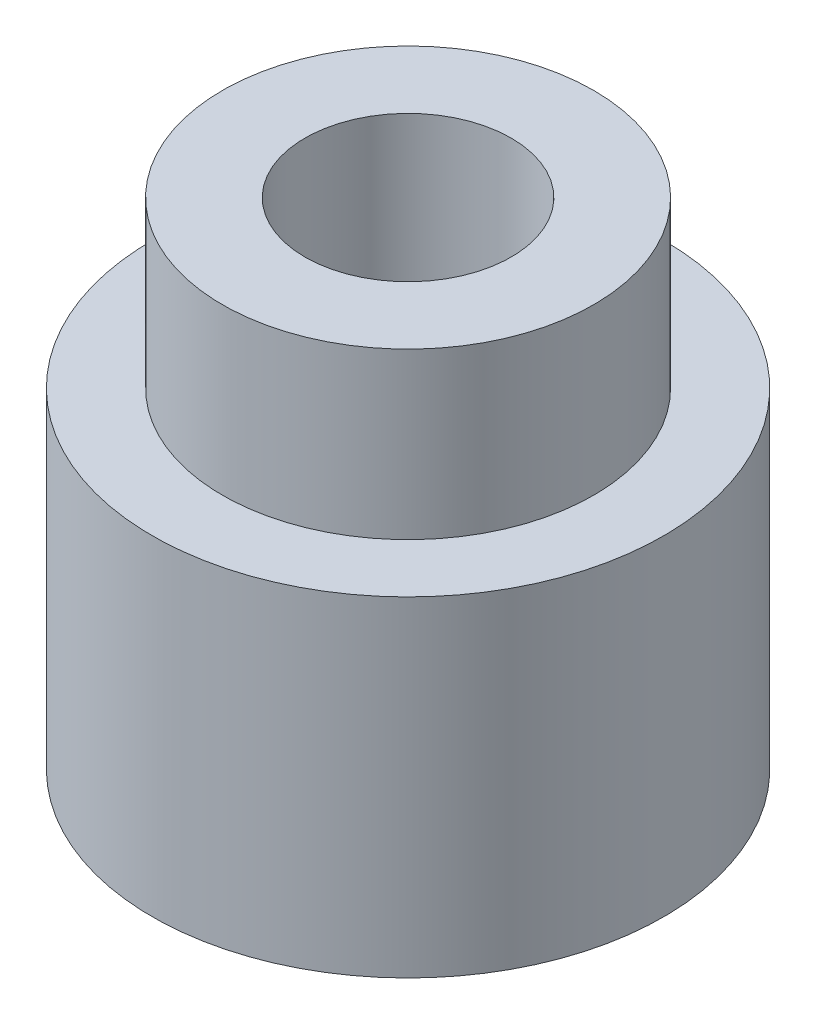
ISO-10303-21;
HEADER;
FILE_DESCRIPTION(('STEP AP214'),'2;1');
FILE_NAME('part.step','',(''),(''),'','','');
FILE_SCHEMA(('AUTOMOTIVE_DESIGN { 1 0 10303 214 1 1 1 1 }'));
ENDSEC;
DATA;
#1=APPLICATION_CONTEXT('core data for automotive mechanical design processes');
#2=APPLICATION_PROTOCOL_DEFINITION('international standard','automotive_design',2000,#1);
#3=PRODUCT_CONTEXT('',#1,'mechanical');
#4=PRODUCT('Part','Part','',(#3));
#5=PRODUCT_RELATED_PRODUCT_CATEGORY('part','',(#4));
#6=PRODUCT_DEFINITION_FORMATION('','',#4);
#7=PRODUCT_DEFINITION_CONTEXT('part definition',#1,'design');
#8=PRODUCT_DEFINITION('design','',#6,#7);
#9=PRODUCT_DEFINITION_SHAPE('','',#8);
#10=(LENGTH_UNIT() NAMED_UNIT(*) SI_UNIT(.MILLI.,.METRE.));
#11=(NAMED_UNIT(*) PLANE_ANGLE_UNIT() SI_UNIT($,.RADIAN.));
#12=(NAMED_UNIT(*) SI_UNIT($,.STERADIAN.) SOLID_ANGLE_UNIT());
#13=UNCERTAINTY_MEASURE_WITH_UNIT(LENGTH_MEASURE(1.E-05),#10,'distance_accuracy_value','');
#14=(GEOMETRIC_REPRESENTATION_CONTEXT(3) GLOBAL_UNCERTAINTY_ASSIGNED_CONTEXT((#13)) GLOBAL_UNIT_ASSIGNED_CONTEXT((#10,
#11,#12)) REPRESENTATION_CONTEXT('',''));
#15=CARTESIAN_POINT('',(0.,0.,0.));
#16=DIRECTION('',(0.,0.,1.));
#17=DIRECTION('',(1.,0.,0.));
#18=AXIS2_PLACEMENT_3D('',#15,#16,#17);
#19=CARTESIAN_POINT('',(0.,0.,4.2));
#20=DIRECTION('',(0.,1.,0.));
#21=DIRECTION('',(0.,0.,1.));
#22=AXIS2_PLACEMENT_3D('',#19,#20,#21);
#23=PLANE('',#22);
#24=CARTESIAN_POINT('',(0.,0.,0.));
#25=DIRECTION('',(0.,-1.,0.));
#26=DIRECTION('',(0.,0.,-1.));
#27=AXIS2_PLACEMENT_3D('',#24,#25,#26);
#28=CIRCLE('',#27,4.2);
#29=CARTESIAN_POINT('',(0.,0.,-4.2));
#30=VERTEX_POINT('',#29);
#31=EDGE_CURVE('E59',#30,#30,#28,.T.);
#32=ORIENTED_EDGE('',*,*,#31,.F.);
#33=EDGE_LOOP('',(#32));
#34=FACE_BOUND('',#33,.T.);
#35=CARTESIAN_POINT('',(0.,0.,0.));
#36=DIRECTION('',(0.,-1.,0.));
#37=DIRECTION('',(0.,0.,-1.));
#38=AXIS2_PLACEMENT_3D('',#35,#36,#37);
#39=CIRCLE('',#38,6.2);
#40=CARTESIAN_POINT('',(0.,0.,-6.2));
#41=VERTEX_POINT('',#40);
#42=EDGE_CURVE('E10',#41,#41,#39,.T.);
#43=ORIENTED_EDGE('',*,*,#42,.T.);
#44=EDGE_LOOP('',(#43));
#45=FACE_BOUND('',#44,.T.);
#46=ADVANCED_FACE('F31',(#34,#45),#23,.F.);
#47=CARTESIAN_POINT('',(0.,0.,0.));
#48=DIRECTION('',(0.,-1.,0.));
#49=DIRECTION('',(0.,0.,-1.));
#50=AXIS2_PLACEMENT_3D('',#47,#48,#49);
#51=CYLINDRICAL_SURFACE('',#50,6.2);
#52=ORIENTED_EDGE('',*,*,#42,.F.);
#53=EDGE_LOOP('',(#52));
#54=FACE_BOUND('',#53,.T.);
#55=CARTESIAN_POINT('',(0.,8.,0.));
#56=DIRECTION('',(0.,-1.,0.));
#57=DIRECTION('',(0.,0.,-1.));
#58=AXIS2_PLACEMENT_3D('',#55,#56,#57);
#59=CIRCLE('',#58,6.2);
#60=CARTESIAN_POINT('',(0.,8.,-6.2));
#61=VERTEX_POINT('',#60);
#62=EDGE_CURVE('E37',#61,#61,#59,.T.);
#63=ORIENTED_EDGE('',*,*,#62,.T.);
#64=EDGE_LOOP('',(#63));
#65=FACE_BOUND('',#64,.T.);
#66=ADVANCED_FACE('F66',(#54,#65),#51,.T.);
#67=CARTESIAN_POINT('',(0.,8.,6.2));
#68=DIRECTION('',(0.,-1.,0.));
#69=DIRECTION('',(0.,0.,-1.));
#70=AXIS2_PLACEMENT_3D('',#67,#68,#69);
#71=PLANE('',#70);
#72=ORIENTED_EDGE('',*,*,#62,.F.);
#73=EDGE_LOOP('',(#72));
#74=FACE_BOUND('',#73,.T.);
#75=CARTESIAN_POINT('',(0.,8.,0.));
#76=DIRECTION('',(0.,-1.,0.));
#77=DIRECTION('',(0.,0.,-1.));
#78=AXIS2_PLACEMENT_3D('',#75,#76,#77);
#79=CIRCLE('',#78,4.5);
#80=CARTESIAN_POINT('',(0.,8.,-4.5));
#81=VERTEX_POINT('',#80);
#82=EDGE_CURVE('E41',#81,#81,#79,.T.);
#83=ORIENTED_EDGE('',*,*,#82,.T.);
#84=EDGE_LOOP('',(#83));
#85=FACE_BOUND('',#84,.T.);
#86=ADVANCED_FACE('F70',(#74,#85),#71,.F.);
#87=CARTESIAN_POINT('',(0.,0.,0.));
#88=DIRECTION('',(0.,-1.,0.));
#89=DIRECTION('',(0.,0.,-1.));
#90=AXIS2_PLACEMENT_3D('',#87,#88,#89);
#91=CYLINDRICAL_SURFACE('',#90,4.5);
#92=ORIENTED_EDGE('',*,*,#82,.F.);
#93=EDGE_LOOP('',(#92));
#94=FACE_BOUND('',#93,.T.);
#95=CARTESIAN_POINT('',(0.,12.,0.));
#96=DIRECTION('',(0.,-1.,0.));
#97=DIRECTION('',(0.,0.,-1.));
#98=AXIS2_PLACEMENT_3D('',#95,#96,#97);
#99=CIRCLE('',#98,4.5);
#100=CARTESIAN_POINT('',(0.,12.,-4.5));
#101=VERTEX_POINT('',#100);
#102=EDGE_CURVE('E45',#101,#101,#99,.T.);
#103=ORIENTED_EDGE('',*,*,#102,.T.);
#104=EDGE_LOOP('',(#103));
#105=FACE_BOUND('',#104,.T.);
#106=ADVANCED_FACE('F75',(#94,#105),#91,.T.);
#107=CARTESIAN_POINT('',(0.,12.,4.5));
#108=DIRECTION('',(0.,-1.,0.));
#109=DIRECTION('',(0.,0.,-1.));
#110=AXIS2_PLACEMENT_3D('',#107,#108,#109);
#111=PLANE('',#110);
#112=ORIENTED_EDGE('',*,*,#102,.F.);
#113=EDGE_LOOP('',(#112));
#114=FACE_BOUND('',#113,.T.);
#115=CARTESIAN_POINT('',(0.,12.,0.));
#116=DIRECTION('',(0.,-1.,0.));
#117=DIRECTION('',(0.,0.,-1.));
#118=AXIS2_PLACEMENT_3D('',#115,#116,#117);
#119=CIRCLE('',#118,2.5);
#120=CARTESIAN_POINT('',(0.,12.,-2.5));
#121=VERTEX_POINT('',#120);
#122=EDGE_CURVE('E50',#121,#121,#119,.T.);
#123=ORIENTED_EDGE('',*,*,#122,.T.);
#124=EDGE_LOOP('',(#123));
#125=FACE_BOUND('',#124,.T.);
#126=ADVANCED_FACE('F81',(#114,#125),#111,.F.);
#127=CARTESIAN_POINT('',(0.,0.,0.));
#128=DIRECTION('',(0.,-1.,0.));
#129=DIRECTION('',(0.,0.,-1.));
#130=AXIS2_PLACEMENT_3D('',#127,#128,#129);
#131=CYLINDRICAL_SURFACE('',#130,2.5);
#132=ORIENTED_EDGE('',*,*,#122,.F.);
#133=EDGE_LOOP('',(#132));
#134=FACE_BOUND('',#133,.T.);
#135=CARTESIAN_POINT('',(0.,6.,0.));
#136=DIRECTION('',(0.,-1.,0.));
#137=DIRECTION('',(0.,0.,-1.));
#138=AXIS2_PLACEMENT_3D('',#135,#136,#137);
#139=CIRCLE('',#138,2.5);
#140=CARTESIAN_POINT('',(0.,6.,-2.5));
#141=VERTEX_POINT('',#140);
#142=EDGE_CURVE('E53',#141,#141,#139,.T.);
#143=ORIENTED_EDGE('',*,*,#142,.T.);
#144=EDGE_LOOP('',(#143));
#145=FACE_BOUND('',#144,.T.);
#146=ADVANCED_FACE('F85',(#134,#145),#131,.F.);
#147=CARTESIAN_POINT('',(0.,6.,2.5));
#148=DIRECTION('',(0.,1.,0.));
#149=DIRECTION('',(0.,0.,1.));
#150=AXIS2_PLACEMENT_3D('',#147,#148,#149);
#151=PLANE('',#150);
#152=ORIENTED_EDGE('',*,*,#142,.F.);
#153=EDGE_LOOP('',(#152));
#154=FACE_BOUND('',#153,.T.);
#155=CARTESIAN_POINT('',(0.,6.,0.));
#156=DIRECTION('',(0.,-1.,0.));
#157=DIRECTION('',(0.,0.,-1.));
#158=AXIS2_PLACEMENT_3D('',#155,#156,#157);
#159=CIRCLE('',#158,4.2);
#160=CARTESIAN_POINT('',(0.,6.,-4.2));
#161=VERTEX_POINT('',#160);
#162=EDGE_CURVE('E56',#161,#161,#159,.T.);
#163=ORIENTED_EDGE('',*,*,#162,.T.);
#164=EDGE_LOOP('',(#163));
#165=FACE_BOUND('',#164,.T.);
#166=ADVANCED_FACE('F89',(#154,#165),#151,.F.);
#167=CARTESIAN_POINT('',(0.,0.,0.));
#168=DIRECTION('',(0.,-1.,0.));
#169=DIRECTION('',(0.,0.,-1.));
#170=AXIS2_PLACEMENT_3D('',#167,#168,#169);
#171=CYLINDRICAL_SURFACE('',#170,4.2);
#172=ORIENTED_EDGE('',*,*,#162,.F.);
#173=EDGE_LOOP('',(#172));
#174=FACE_BOUND('',#173,.T.);
#175=ORIENTED_EDGE('',*,*,#31,.T.);
#176=EDGE_LOOP('',(#175));
#177=FACE_BOUND('',#176,.T.);
#178=ADVANCED_FACE('F63',(#174,#177),#171,.F.);
#179=CLOSED_SHELL('',(#46,#66,#86,#106,#126,#146,#166,#178));
#180=MANIFOLD_SOLID_BREP('B2',#179);
#181=ADVANCED_BREP_SHAPE_REPRESENTATION('',(#18,#180),#14);
#182=SHAPE_DEFINITION_REPRESENTATION(#9,#181);
ENDSEC;
END-ISO-10303-21;
